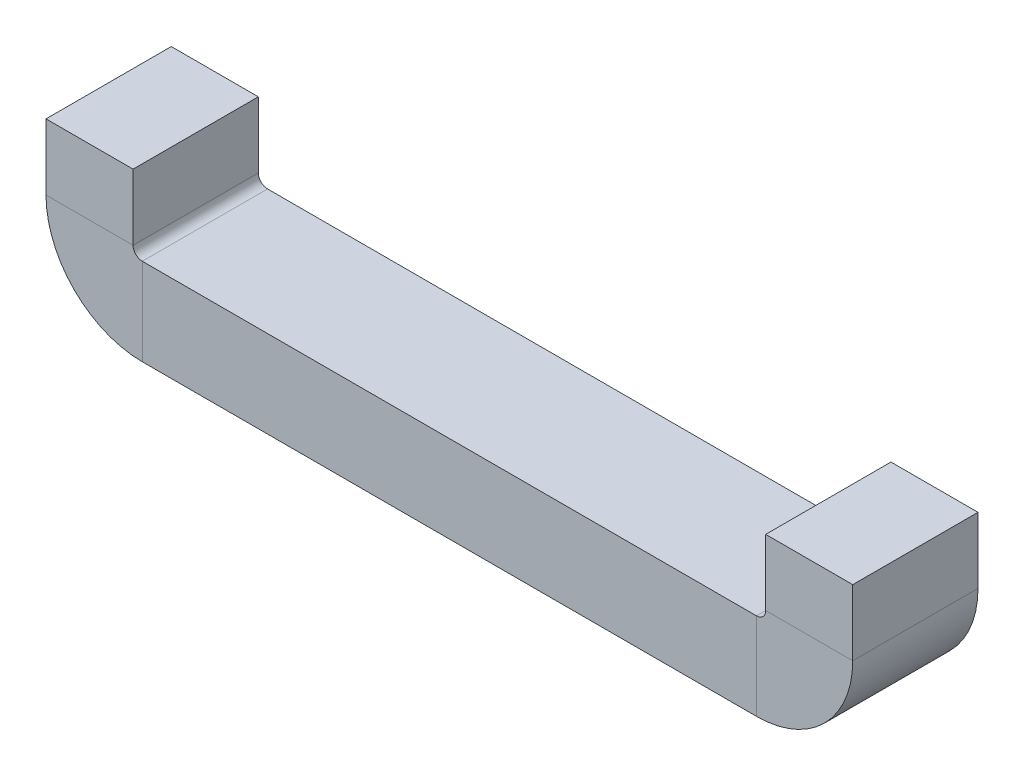
ISO-10303-21;
HEADER;
FILE_DESCRIPTION(('STEP AP214'),'2;1');
FILE_NAME('part.step','',(''),(''),'','','');
FILE_SCHEMA(('AUTOMOTIVE_DESIGN { 1 0 10303 214 1 1 1 1 }'));
ENDSEC;
DATA;
#1=APPLICATION_CONTEXT('core data for automotive mechanical design processes');
#2=APPLICATION_PROTOCOL_DEFINITION('international standard','automotive_design',2000,#1);
#3=PRODUCT_CONTEXT('',#1,'mechanical');
#4=PRODUCT('Part','Part','',(#3));
#5=PRODUCT_RELATED_PRODUCT_CATEGORY('part','',(#4));
#6=PRODUCT_DEFINITION_FORMATION('','',#4);
#7=PRODUCT_DEFINITION_CONTEXT('part definition',#1,'design');
#8=PRODUCT_DEFINITION('design','',#6,#7);
#9=PRODUCT_DEFINITION_SHAPE('','',#8);
#10=(LENGTH_UNIT() NAMED_UNIT(*) SI_UNIT(.MILLI.,.METRE.));
#11=(NAMED_UNIT(*) PLANE_ANGLE_UNIT() SI_UNIT($,.RADIAN.));
#12=(NAMED_UNIT(*) SI_UNIT($,.STERADIAN.) SOLID_ANGLE_UNIT());
#13=UNCERTAINTY_MEASURE_WITH_UNIT(LENGTH_MEASURE(1.E-05),#10,'distance_accuracy_value','');
#14=(GEOMETRIC_REPRESENTATION_CONTEXT(3) GLOBAL_UNCERTAINTY_ASSIGNED_CONTEXT((#13)) GLOBAL_UNIT_ASSIGNED_CONTEXT((#10,
#11,#12)) REPRESENTATION_CONTEXT('',''));
#15=CARTESIAN_POINT('',(0.,0.,0.));
#16=DIRECTION('',(0.,0.,1.));
#17=DIRECTION('',(1.,0.,0.));
#18=AXIS2_PLACEMENT_3D('',#15,#16,#17);
#19=CARTESIAN_POINT('',(0.,-6.95,0.));
#20=DIRECTION('',(0.,-1.,0.));
#21=DIRECTION('',(0.,0.,-1.));
#22=AXIS2_PLACEMENT_3D('',#19,#20,#21);
#23=PLANE('',#22);
#24=DIRECTION('',(-1.,0.,0.));
#25=VECTOR('',#24,1.);
#26=CARTESIAN_POINT('',(25.25,-6.95,-5.));
#27=LINE('',#26,#25);
#28=CARTESIAN_POINT('',(24.5134,-6.95,-5.));
#29=VERTEX_POINT('',#28);
#30=CARTESIAN_POINT('',(-24.5134,-6.95,-5.));
#31=VERTEX_POINT('',#30);
#32=EDGE_CURVE('E11',#29,#31,#27,.T.);
#33=ORIENTED_EDGE('',*,*,#32,.F.);
#34=DIRECTION('',(0.,0.,-1.));
#35=VECTOR('',#34,1.);
#36=CARTESIAN_POINT('',(24.5134,-6.95,-5.));
#37=LINE('',#36,#35);
#38=CARTESIAN_POINT('',(24.5134,-6.95,4.99999999999999));
#39=VERTEX_POINT('',#38);
#40=EDGE_CURVE('E138',#29,#39,#37,.F.);
#41=ORIENTED_EDGE('',*,*,#40,.T.);
#42=DIRECTION('',(1.,0.,0.));
#43=VECTOR('',#42,1.);
#44=CARTESIAN_POINT('',(25.25,-6.95,5.));
#45=LINE('',#44,#43);
#46=CARTESIAN_POINT('',(-24.5134,-6.95,5.00000000000001));
#47=VERTEX_POINT('',#46);
#48=EDGE_CURVE('E52',#47,#39,#45,.T.);
#49=ORIENTED_EDGE('',*,*,#48,.F.);
#50=DIRECTION('',(0.,0.,1.));
#51=VECTOR('',#50,1.);
#52=CARTESIAN_POINT('',(-24.5134,-6.95,5.00000000000001));
#53=LINE('',#52,#51);
#54=EDGE_CURVE('E225',#47,#31,#53,.F.);
#55=ORIENTED_EDGE('',*,*,#54,.T.);
#56=EDGE_LOOP('',(#33,#41,#49,#55));
#57=FACE_BOUND('',#56,.T.);
#58=ADVANCED_FACE('F43',(#57),#23,.T.);
#59=CARTESIAN_POINT('',(0.,0.,0.));
#60=DIRECTION('',(0.,-1.,0.));
#61=DIRECTION('',(0.,0.,-1.));
#62=AXIS2_PLACEMENT_3D('',#59,#60,#61);
#63=PLANE('',#62);
#64=DIRECTION('',(0.,0.,-1.));
#65=VECTOR('',#64,1.);
#66=CARTESIAN_POINT('',(24.5134,0.,-5.));
#67=LINE('',#66,#65);
#68=CARTESIAN_POINT('',(24.5134,0.,-5.));
#69=VERTEX_POINT('',#68);
#70=CARTESIAN_POINT('',(24.5134,0.,4.99999999999999));
#71=VERTEX_POINT('',#70);
#72=EDGE_CURVE('E188',#69,#71,#67,.F.);
#73=ORIENTED_EDGE('',*,*,#72,.F.);
#74=DIRECTION('',(-1.,0.,0.));
#75=VECTOR('',#74,1.);
#76=CARTESIAN_POINT('',(25.25,0.,-5.));
#77=LINE('',#76,#75);
#78=CARTESIAN_POINT('',(-24.5134,0.,-5.));
#79=VERTEX_POINT('',#78);
#80=EDGE_CURVE('E47',#69,#79,#77,.T.);
#81=ORIENTED_EDGE('',*,*,#80,.T.);
#82=DIRECTION('',(0.,0.,1.));
#83=VECTOR('',#82,1.);
#84=CARTESIAN_POINT('',(-24.5134,0.,5.00000000000001));
#85=LINE('',#84,#83);
#86=CARTESIAN_POINT('',(-24.5134,0.,5.00000000000001));
#87=VERTEX_POINT('',#86);
#88=EDGE_CURVE('E236',#87,#79,#85,.F.);
#89=ORIENTED_EDGE('',*,*,#88,.F.);
#90=DIRECTION('',(1.,0.,0.));
#91=VECTOR('',#90,1.);
#92=CARTESIAN_POINT('',(25.25,0.,5.));
#93=LINE('',#92,#91);
#94=EDGE_CURVE('E242',#87,#71,#93,.T.);
#95=ORIENTED_EDGE('',*,*,#94,.T.);
#96=EDGE_LOOP('',(#73,#81,#89,#95));
#97=FACE_BOUND('',#96,.T.);
#98=ADVANCED_FACE('F254',(#97),#63,.F.);
#99=CARTESIAN_POINT('',(25.25,-6.95,-5.));
#100=DIRECTION('',(0.,0.,-1.));
#101=DIRECTION('',(-1.,0.,0.));
#102=AXIS2_PLACEMENT_3D('',#99,#100,#101);
#103=PLANE('',#102);
#104=ORIENTED_EDGE('',*,*,#80,.F.);
#105=DIRECTION('',(0.,-1.,0.));
#106=VECTOR('',#105,1.);
#107=CARTESIAN_POINT('',(24.5134,0.,-5.));
#108=LINE('',#107,#106);
#109=EDGE_CURVE('E184',#69,#29,#108,.T.);
#110=ORIENTED_EDGE('',*,*,#109,.T.);
#111=ORIENTED_EDGE('',*,*,#32,.T.);
#112=DIRECTION('',(0.,-1.,0.));
#113=VECTOR('',#112,1.);
#114=CARTESIAN_POINT('',(-24.5134,0.,-5.));
#115=LINE('',#114,#113);
#116=EDGE_CURVE('E240',#79,#31,#115,.T.);
#117=ORIENTED_EDGE('',*,*,#116,.F.);
#118=EDGE_LOOP('',(#104,#110,#111,#117));
#119=FACE_BOUND('',#118,.T.);
#120=ADVANCED_FACE('F256',(#119),#103,.T.);
#121=CARTESIAN_POINT('',(25.25,-6.95,5.));
#122=DIRECTION('',(0.,0.,1.));
#123=DIRECTION('',(1.,0.,0.));
#124=AXIS2_PLACEMENT_3D('',#121,#122,#123);
#125=PLANE('',#124);
#126=DIRECTION('',(0.,-1.,0.));
#127=VECTOR('',#126,1.);
#128=CARTESIAN_POINT('',(24.5134,0.,4.99999999999999));
#129=LINE('',#128,#127);
#130=EDGE_CURVE('E191',#71,#39,#129,.T.);
#131=ORIENTED_EDGE('',*,*,#130,.F.);
#132=ORIENTED_EDGE('',*,*,#94,.F.);
#133=DIRECTION('',(0.,-1.,0.));
#134=VECTOR('',#133,1.);
#135=CARTESIAN_POINT('',(-24.5134,0.,5.00000000000001));
#136=LINE('',#135,#134);
#137=EDGE_CURVE('E230',#87,#47,#136,.T.);
#138=ORIENTED_EDGE('',*,*,#137,.T.);
#139=ORIENTED_EDGE('',*,*,#48,.T.);
#140=EDGE_LOOP('',(#131,#132,#138,#139));
#141=FACE_BOUND('',#140,.T.);
#142=ADVANCED_FACE('F45',(#141),#125,.T.);
#143=CARTESIAN_POINT('',(-24.5134,0.7366,-5.));
#144=DIRECTION('',(0.,0.,-1.));
#145=DIRECTION('',(-1.,0.,0.));
#146=AXIS2_PLACEMENT_3D('',#143,#144,#145);
#147=PLANE('',#146);
#148=DIRECTION('',(-1.,0.,0.));
#149=VECTOR('',#148,1.);
#150=CARTESIAN_POINT('',(-25.25,0.736599999999997,-5.));
#151=LINE('',#150,#149);
#152=CARTESIAN_POINT('',(-25.25,0.736599999999997,-5.));
#153=VERTEX_POINT('',#152);
#154=CARTESIAN_POINT('',(-32.2,0.736599999999972,-5.));
#155=VERTEX_POINT('',#154);
#156=EDGE_CURVE('E193',#153,#155,#151,.T.);
#157=ORIENTED_EDGE('',*,*,#156,.F.);
#158=CARTESIAN_POINT('',(-24.5134,0.7366,-5.));
#159=DIRECTION('',(0.,0.,1.));
#160=DIRECTION('',(1.,0.,0.));
#161=AXIS2_PLACEMENT_3D('',#158,#159,#160);
#162=CIRCLE('',#161,0.736600000000004);
#163=EDGE_CURVE('E233',#79,#153,#162,.F.);
#164=ORIENTED_EDGE('',*,*,#163,.F.);
#165=ORIENTED_EDGE('',*,*,#116,.T.);
#166=CARTESIAN_POINT('',(-24.5134,0.7366,-5.));
#167=DIRECTION('',(0.,0.,1.));
#168=DIRECTION('',(1.,0.,0.));
#169=AXIS2_PLACEMENT_3D('',#166,#167,#168);
#170=CIRCLE('',#169,7.6866);
#171=EDGE_CURVE('E60',#31,#155,#170,.F.);
#172=ORIENTED_EDGE('',*,*,#171,.T.);
#173=EDGE_LOOP('',(#157,#164,#165,#172));
#174=FACE_BOUND('',#173,.T.);
#175=ADVANCED_FACE('F260',(#174),#147,.T.);
#176=CARTESIAN_POINT('',(-24.5134,0.7366,5.00000000000001));
#177=DIRECTION('',(0.,0.,-1.));
#178=DIRECTION('',(-1.,0.,0.));
#179=AXIS2_PLACEMENT_3D('',#176,#177,#178);
#180=PLANE('',#179);
#181=CARTESIAN_POINT('',(-24.5134,0.7366,5.00000000000001));
#182=DIRECTION('',(0.,0.,1.));
#183=DIRECTION('',(1.,0.,0.));
#184=AXIS2_PLACEMENT_3D('',#181,#182,#183);
#185=CIRCLE('',#184,0.736600000000004);
#186=CARTESIAN_POINT('',(-25.25,0.736599999999997,5.00000000000001));
#187=VERTEX_POINT('',#186);
#188=EDGE_CURVE('E224',#187,#87,#185,.T.);
#189=ORIENTED_EDGE('',*,*,#188,.F.);
#190=DIRECTION('',(-1.,0.,0.));
#191=VECTOR('',#190,1.);
#192=CARTESIAN_POINT('',(-25.25,0.736599999999997,5.00000000000001));
#193=LINE('',#192,#191);
#194=CARTESIAN_POINT('',(-32.2,0.736599999999973,5.00000000000001));
#195=VERTEX_POINT('',#194);
#196=EDGE_CURVE('E197',#187,#195,#193,.T.);
#197=ORIENTED_EDGE('',*,*,#196,.T.);
#198=CARTESIAN_POINT('',(-24.5134,0.7366,5.00000000000001));
#199=DIRECTION('',(0.,0.,1.));
#200=DIRECTION('',(1.,0.,0.));
#201=AXIS2_PLACEMENT_3D('',#198,#199,#200);
#202=CIRCLE('',#201,7.6866);
#203=EDGE_CURVE('E228',#195,#47,#202,.T.);
#204=ORIENTED_EDGE('',*,*,#203,.T.);
#205=ORIENTED_EDGE('',*,*,#137,.F.);
#206=EDGE_LOOP('',(#189,#197,#204,#205));
#207=FACE_BOUND('',#206,.T.);
#208=ADVANCED_FACE('F284',(#207),#180,.F.);
#209=CARTESIAN_POINT('',(-24.5134,0.7366,5.00000000000001));
#210=DIRECTION('',(0.,0.,1.));
#211=DIRECTION('',(-1.,0.,0.));
#212=AXIS2_PLACEMENT_3D('',#209,#210,#211);
#213=CYLINDRICAL_SURFACE('',#212,7.6866);
#214=ORIENTED_EDGE('',*,*,#54,.F.);
#215=ORIENTED_EDGE('',*,*,#203,.F.);
#216=DIRECTION('',(0.,0.,-1.));
#217=VECTOR('',#216,1.);
#218=CARTESIAN_POINT('',(-32.2,0.736599999999973,0.));
#219=LINE('',#218,#217);
#220=EDGE_CURVE('E200',#195,#155,#219,.T.);
#221=ORIENTED_EDGE('',*,*,#220,.T.);
#222=ORIENTED_EDGE('',*,*,#171,.F.);
#223=EDGE_LOOP('',(#214,#215,#221,#222));
#224=FACE_BOUND('',#223,.T.);
#225=ADVANCED_FACE('F287',(#224),#213,.T.);
#226=CARTESIAN_POINT('',(-24.5134,0.7366,5.00000000000001));
#227=DIRECTION('',(0.,0.,1.));
#228=DIRECTION('',(-1.,0.,0.));
#229=AXIS2_PLACEMENT_3D('',#226,#227,#228);
#230=CYLINDRICAL_SURFACE('',#229,0.736600000000004);
#231=ORIENTED_EDGE('',*,*,#88,.T.);
#232=ORIENTED_EDGE('',*,*,#163,.T.);
#233=DIRECTION('',(0.,0.,1.));
#234=VECTOR('',#233,1.);
#235=CARTESIAN_POINT('',(-25.25,0.736599999999997,-5.));
#236=LINE('',#235,#234);
#237=EDGE_CURVE('E195',#153,#187,#236,.T.);
#238=ORIENTED_EDGE('',*,*,#237,.T.);
#239=ORIENTED_EDGE('',*,*,#188,.T.);
#240=EDGE_LOOP('',(#231,#232,#238,#239));
#241=FACE_BOUND('',#240,.T.);
#242=ADVANCED_FACE('F263',(#241),#230,.F.);
#243=CARTESIAN_POINT('',(-32.2,5.99999999999998,5.00000000000001));
#244=DIRECTION('',(0.,0.,-1.));
#245=DIRECTION('',(-1.,0.,0.));
#246=AXIS2_PLACEMENT_3D('',#243,#244,#245);
#247=PLANE('',#246);
#248=ORIENTED_EDGE('',*,*,#196,.F.);
#249=DIRECTION('',(0.,1.,0.));
#250=VECTOR('',#249,1.);
#251=CARTESIAN_POINT('',(-25.25,6.,5.00000000000001));
#252=LINE('',#251,#250);
#253=CARTESIAN_POINT('',(-25.25,6.,5.00000000000001));
#254=VERTEX_POINT('',#253);
#255=EDGE_CURVE('E204',#187,#254,#252,.T.);
#256=ORIENTED_EDGE('',*,*,#255,.T.);
#257=DIRECTION('',(1.,0.,0.));
#258=VECTOR('',#257,1.);
#259=CARTESIAN_POINT('',(-32.2,5.99999999999998,5.00000000000001));
#260=LINE('',#259,#258);
#261=CARTESIAN_POINT('',(-32.2,5.99999999999998,5.00000000000001));
#262=VERTEX_POINT('',#261);
#263=EDGE_CURVE('E221',#262,#254,#260,.T.);
#264=ORIENTED_EDGE('',*,*,#263,.F.);
#265=DIRECTION('',(0.,1.,0.));
#266=VECTOR('',#265,1.);
#267=CARTESIAN_POINT('',(-32.2,5.99999999999998,5.00000000000001));
#268=LINE('',#267,#266);
#269=EDGE_CURVE('E205',#195,#262,#268,.T.);
#270=ORIENTED_EDGE('',*,*,#269,.F.);
#271=EDGE_LOOP('',(#248,#256,#264,#270));
#272=FACE_BOUND('',#271,.T.);
#273=ADVANCED_FACE('F281',(#272),#247,.F.);
#274=CARTESIAN_POINT('',(-32.2,0.,-5.));
#275=DIRECTION('',(0.,0.,1.));
#276=DIRECTION('',(1.,0.,0.));
#277=AXIS2_PLACEMENT_3D('',#274,#275,#276);
#278=PLANE('',#277);
#279=ORIENTED_EDGE('',*,*,#156,.T.);
#280=DIRECTION('',(0.,-1.,0.));
#281=VECTOR('',#280,1.);
#282=CARTESIAN_POINT('',(-32.2,0.,-5.));
#283=LINE('',#282,#281);
#284=CARTESIAN_POINT('',(-32.2,5.99999999999998,-5.));
#285=VERTEX_POINT('',#284);
#286=EDGE_CURVE('E210',#285,#155,#283,.T.);
#287=ORIENTED_EDGE('',*,*,#286,.F.);
#288=DIRECTION('',(1.,0.,0.));
#289=VECTOR('',#288,1.);
#290=CARTESIAN_POINT('',(-32.2,5.99999999999998,-5.));
#291=LINE('',#290,#289);
#292=CARTESIAN_POINT('',(-25.25,6.,-5.));
#293=VERTEX_POINT('',#292);
#294=EDGE_CURVE('E213',#285,#293,#291,.T.);
#295=ORIENTED_EDGE('',*,*,#294,.T.);
#296=DIRECTION('',(0.,-1.,0.));
#297=VECTOR('',#296,1.);
#298=CARTESIAN_POINT('',(-25.25,0.,-5.));
#299=LINE('',#298,#297);
#300=EDGE_CURVE('E208',#293,#153,#299,.T.);
#301=ORIENTED_EDGE('',*,*,#300,.T.);
#302=EDGE_LOOP('',(#279,#287,#295,#301));
#303=FACE_BOUND('',#302,.T.);
#304=ADVANCED_FACE('F271',(#303),#278,.F.);
#305=CARTESIAN_POINT('',(-32.2,-1.11869330841789E-13,0.));
#306=DIRECTION('',(1.,0.,0.));
#307=DIRECTION('',(0.,1.,0.));
#308=AXIS2_PLACEMENT_3D('',#305,#306,#307);
#309=PLANE('',#308);
#310=ORIENTED_EDGE('',*,*,#220,.F.);
#311=ORIENTED_EDGE('',*,*,#269,.T.);
#312=DIRECTION('',(0.,0.,-1.));
#313=VECTOR('',#312,1.);
#314=CARTESIAN_POINT('',(-32.2,5.99999999999998,-5.));
#315=LINE('',#314,#313);
#316=EDGE_CURVE('E207',#262,#285,#315,.T.);
#317=ORIENTED_EDGE('',*,*,#316,.T.);
#318=ORIENTED_EDGE('',*,*,#286,.T.);
#319=EDGE_LOOP('',(#310,#311,#317,#318));
#320=FACE_BOUND('',#319,.T.);
#321=ADVANCED_FACE('F286',(#320),#309,.F.);
#322=CARTESIAN_POINT('',(-25.25,0.,0.));
#323=DIRECTION('',(1.,0.,0.));
#324=DIRECTION('',(0.,1.,0.));
#325=AXIS2_PLACEMENT_3D('',#322,#323,#324);
#326=PLANE('',#325);
#327=ORIENTED_EDGE('',*,*,#255,.F.);
#328=ORIENTED_EDGE('',*,*,#237,.F.);
#329=ORIENTED_EDGE('',*,*,#300,.F.);
#330=DIRECTION('',(0.,0.,-1.));
#331=VECTOR('',#330,1.);
#332=CARTESIAN_POINT('',(-25.25,6.,-5.));
#333=LINE('',#332,#331);
#334=EDGE_CURVE('E215',#254,#293,#333,.T.);
#335=ORIENTED_EDGE('',*,*,#334,.F.);
#336=EDGE_LOOP('',(#327,#328,#329,#335));
#337=FACE_BOUND('',#336,.T.);
#338=ADVANCED_FACE('F268',(#337),#326,.T.);
#339=CARTESIAN_POINT('',(-32.2,5.99999999999998,-5.));
#340=DIRECTION('',(0.,-1.,0.));
#341=DIRECTION('',(1.,0.,0.));
#342=AXIS2_PLACEMENT_3D('',#339,#340,#341);
#343=PLANE('',#342);
#344=ORIENTED_EDGE('',*,*,#334,.T.);
#345=ORIENTED_EDGE('',*,*,#294,.F.);
#346=ORIENTED_EDGE('',*,*,#316,.F.);
#347=ORIENTED_EDGE('',*,*,#263,.T.);
#348=EDGE_LOOP('',(#344,#345,#346,#347));
#349=FACE_BOUND('',#348,.T.);
#350=ADVANCED_FACE('F276',(#349),#343,.F.);
#351=CARTESIAN_POINT('',(24.5134,0.7366,4.99999999999999));
#352=DIRECTION('',(0.,0.,1.));
#353=DIRECTION('',(0.,-1.,0.));
#354=AXIS2_PLACEMENT_3D('',#351,#352,#353);
#355=PLANE('',#354);
#356=DIRECTION('',(1.,0.,0.));
#357=VECTOR('',#356,1.);
#358=CARTESIAN_POINT('',(25.25,0.736599999999997,5.));
#359=LINE('',#358,#357);
#360=CARTESIAN_POINT('',(25.25,0.736599999999997,4.99999999999999));
#361=VERTEX_POINT('',#360);
#362=CARTESIAN_POINT('',(32.2,0.736599999999973,4.99999999999999));
#363=VERTEX_POINT('',#362);
#364=EDGE_CURVE('E296',#361,#363,#359,.T.);
#365=ORIENTED_EDGE('',*,*,#364,.F.);
#366=CARTESIAN_POINT('',(24.5134,0.7366,4.99999999999999));
#367=DIRECTION('',(0.,0.,-1.));
#368=DIRECTION('',(0.,1.,0.));
#369=AXIS2_PLACEMENT_3D('',#366,#367,#368);
#370=CIRCLE('',#369,0.7366);
#371=EDGE_CURVE('E141',#71,#361,#370,.F.);
#372=ORIENTED_EDGE('',*,*,#371,.F.);
#373=ORIENTED_EDGE('',*,*,#130,.T.);
#374=CARTESIAN_POINT('',(24.5134,0.7366,4.99999999999999));
#375=DIRECTION('',(0.,0.,-1.));
#376=DIRECTION('',(0.,1.,0.));
#377=AXIS2_PLACEMENT_3D('',#374,#375,#376);
#378=CIRCLE('',#377,7.6866);
#379=EDGE_CURVE('E68',#39,#363,#378,.F.);
#380=ORIENTED_EDGE('',*,*,#379,.T.);
#381=EDGE_LOOP('',(#365,#372,#373,#380));
#382=FACE_BOUND('',#381,.T.);
#383=ADVANCED_FACE('F294',(#382),#355,.T.);
#384=CARTESIAN_POINT('',(24.5134,0.736599999999996,-5.));
#385=DIRECTION('',(0.,0.,1.));
#386=DIRECTION('',(0.,-1.,0.));
#387=AXIS2_PLACEMENT_3D('',#384,#385,#386);
#388=PLANE('',#387);
#389=CARTESIAN_POINT('',(24.5134,0.736599999999996,-5.));
#390=DIRECTION('',(0.,0.,-1.));
#391=DIRECTION('',(0.,1.,0.));
#392=AXIS2_PLACEMENT_3D('',#389,#390,#391);
#393=CIRCLE('',#392,0.7366);
#394=CARTESIAN_POINT('',(25.25,0.736599999999993,-5.));
#395=VERTEX_POINT('',#394);
#396=EDGE_CURVE('E148',#395,#69,#393,.T.);
#397=ORIENTED_EDGE('',*,*,#396,.F.);
#398=DIRECTION('',(1.,0.,0.));
#399=VECTOR('',#398,1.);
#400=CARTESIAN_POINT('',(25.25,0.736599999999993,-5.));
#401=LINE('',#400,#399);
#402=CARTESIAN_POINT('',(32.2,0.736599999999969,-5.00000000000001));
#403=VERTEX_POINT('',#402);
#404=EDGE_CURVE('E145',#395,#403,#401,.T.);
#405=ORIENTED_EDGE('',*,*,#404,.T.);
#406=CARTESIAN_POINT('',(24.5134,0.736599999999996,-5.));
#407=DIRECTION('',(0.,0.,-1.));
#408=DIRECTION('',(0.,1.,0.));
#409=AXIS2_PLACEMENT_3D('',#406,#407,#408);
#410=CIRCLE('',#409,7.6866);
#411=EDGE_CURVE('E132',#403,#29,#410,.T.);
#412=ORIENTED_EDGE('',*,*,#411,.T.);
#413=ORIENTED_EDGE('',*,*,#109,.F.);
#414=EDGE_LOOP('',(#397,#405,#412,#413));
#415=FACE_BOUND('',#414,.T.);
#416=ADVANCED_FACE('F146',(#415),#388,.F.);
#417=CARTESIAN_POINT('',(24.5134,0.736599999999996,-5.));
#418=DIRECTION('',(0.,0.,-1.));
#419=DIRECTION('',(1.,0.,0.));
#420=AXIS2_PLACEMENT_3D('',#417,#418,#419);
#421=CYLINDRICAL_SURFACE('',#420,7.6866);
#422=ORIENTED_EDGE('',*,*,#40,.F.);
#423=ORIENTED_EDGE('',*,*,#411,.F.);
#424=DIRECTION('',(0.,0.,1.));
#425=VECTOR('',#424,1.);
#426=CARTESIAN_POINT('',(32.2,0.736599999999971,0.));
#427=LINE('',#426,#425);
#428=EDGE_CURVE('E136',#403,#363,#427,.T.);
#429=ORIENTED_EDGE('',*,*,#428,.T.);
#430=ORIENTED_EDGE('',*,*,#379,.F.);
#431=EDGE_LOOP('',(#422,#423,#429,#430));
#432=FACE_BOUND('',#431,.T.);
#433=ADVANCED_FACE('F134',(#432),#421,.T.);
#434=CARTESIAN_POINT('',(24.5134,0.736599999999996,-5.));
#435=DIRECTION('',(0.,0.,-1.));
#436=DIRECTION('',(1.,0.,0.));
#437=AXIS2_PLACEMENT_3D('',#434,#435,#436);
#438=CYLINDRICAL_SURFACE('',#437,0.7366);
#439=ORIENTED_EDGE('',*,*,#72,.T.);
#440=ORIENTED_EDGE('',*,*,#371,.T.);
#441=DIRECTION('',(0.,0.,-1.));
#442=VECTOR('',#441,1.);
#443=CARTESIAN_POINT('',(25.25,0.736599999999997,5.));
#444=LINE('',#443,#442);
#445=EDGE_CURVE('E152',#361,#395,#444,.T.);
#446=ORIENTED_EDGE('',*,*,#445,.T.);
#447=ORIENTED_EDGE('',*,*,#396,.T.);
#448=EDGE_LOOP('',(#439,#440,#446,#447));
#449=FACE_BOUND('',#448,.T.);
#450=ADVANCED_FACE('F299',(#449),#438,.F.);
#451=CARTESIAN_POINT('',(32.2,5.99999999999998,-5.00000000000001));
#452=DIRECTION('',(0.,0.,1.));
#453=DIRECTION('',(1.,0.,0.));
#454=AXIS2_PLACEMENT_3D('',#451,#452,#453);
#455=PLANE('',#454);
#456=ORIENTED_EDGE('',*,*,#404,.F.);
#457=DIRECTION('',(0.,1.,0.));
#458=VECTOR('',#457,1.);
#459=CARTESIAN_POINT('',(25.25,6.,-5.));
#460=LINE('',#459,#458);
#461=CARTESIAN_POINT('',(25.25,6.,-5.));
#462=VERTEX_POINT('',#461);
#463=EDGE_CURVE('E161',#395,#462,#460,.T.);
#464=ORIENTED_EDGE('',*,*,#463,.T.);
#465=DIRECTION('',(-1.,0.,0.));
#466=VECTOR('',#465,1.);
#467=CARTESIAN_POINT('',(32.2,5.99999999999998,-5.00000000000001));
#468=LINE('',#467,#466);
#469=CARTESIAN_POINT('',(32.2,5.99999999999998,-5.00000000000001));
#470=VERTEX_POINT('',#469);
#471=EDGE_CURVE('E165',#470,#462,#468,.T.);
#472=ORIENTED_EDGE('',*,*,#471,.F.);
#473=DIRECTION('',(0.,1.,0.));
#474=VECTOR('',#473,1.);
#475=CARTESIAN_POINT('',(32.2,5.99999999999998,-5.00000000000001));
#476=LINE('',#475,#474);
#477=EDGE_CURVE('E157',#403,#470,#476,.T.);
#478=ORIENTED_EDGE('',*,*,#477,.F.);
#479=EDGE_LOOP('',(#456,#464,#472,#478));
#480=FACE_BOUND('',#479,.T.);
#481=ADVANCED_FACE('F163',(#480),#455,.F.);
#482=CARTESIAN_POINT('',(32.2,0.,4.99999999999999));
#483=DIRECTION('',(0.,0.,-1.));
#484=DIRECTION('',(-1.,0.,0.));
#485=AXIS2_PLACEMENT_3D('',#482,#483,#484);
#486=PLANE('',#485);
#487=ORIENTED_EDGE('',*,*,#364,.T.);
#488=DIRECTION('',(0.,-1.,0.));
#489=VECTOR('',#488,1.);
#490=CARTESIAN_POINT('',(32.2,0.,4.99999999999999));
#491=LINE('',#490,#489);
#492=CARTESIAN_POINT('',(32.2,5.99999999999998,4.99999999999999));
#493=VERTEX_POINT('',#492);
#494=EDGE_CURVE('E160',#493,#363,#491,.T.);
#495=ORIENTED_EDGE('',*,*,#494,.F.);
#496=DIRECTION('',(-1.,0.,0.));
#497=VECTOR('',#496,1.);
#498=CARTESIAN_POINT('',(32.2,5.99999999999998,4.99999999999999));
#499=LINE('',#498,#497);
#500=CARTESIAN_POINT('',(25.25,6.,5.));
#501=VERTEX_POINT('',#500);
#502=EDGE_CURVE('E177',#493,#501,#499,.T.);
#503=ORIENTED_EDGE('',*,*,#502,.T.);
#504=DIRECTION('',(0.,-1.,0.));
#505=VECTOR('',#504,1.);
#506=CARTESIAN_POINT('',(25.25,0.,5.));
#507=LINE('',#506,#505);
#508=EDGE_CURVE('E168',#501,#361,#507,.T.);
#509=ORIENTED_EDGE('',*,*,#508,.T.);
#510=EDGE_LOOP('',(#487,#495,#503,#509));
#511=FACE_BOUND('',#510,.T.);
#512=ADVANCED_FACE('F306',(#511),#486,.F.);
#513=CARTESIAN_POINT('',(32.2,-1.11869330841789E-13,0.));
#514=DIRECTION('',(-1.,0.,0.));
#515=DIRECTION('',(0.,-1.,0.));
#516=AXIS2_PLACEMENT_3D('',#513,#514,#515);
#517=PLANE('',#516);
#518=ORIENTED_EDGE('',*,*,#428,.F.);
#519=ORIENTED_EDGE('',*,*,#477,.T.);
#520=DIRECTION('',(0.,0.,1.));
#521=VECTOR('',#520,1.);
#522=CARTESIAN_POINT('',(32.2,5.99999999999998,4.99999999999999));
#523=LINE('',#522,#521);
#524=EDGE_CURVE('E167',#470,#493,#523,.T.);
#525=ORIENTED_EDGE('',*,*,#524,.T.);
#526=ORIENTED_EDGE('',*,*,#494,.T.);
#527=EDGE_LOOP('',(#518,#519,#525,#526));
#528=FACE_BOUND('',#527,.T.);
#529=ADVANCED_FACE('F156',(#528),#517,.F.);
#530=CARTESIAN_POINT('',(25.25,0.,0.));
#531=DIRECTION('',(-1.,0.,0.));
#532=DIRECTION('',(0.,-1.,0.));
#533=AXIS2_PLACEMENT_3D('',#530,#531,#532);
#534=PLANE('',#533);
#535=ORIENTED_EDGE('',*,*,#463,.F.);
#536=ORIENTED_EDGE('',*,*,#445,.F.);
#537=ORIENTED_EDGE('',*,*,#508,.F.);
#538=DIRECTION('',(0.,0.,1.));
#539=VECTOR('',#538,1.);
#540=CARTESIAN_POINT('',(25.25,6.,5.));
#541=LINE('',#540,#539);
#542=EDGE_CURVE('E172',#462,#501,#541,.T.);
#543=ORIENTED_EDGE('',*,*,#542,.F.);
#544=EDGE_LOOP('',(#535,#536,#537,#543));
#545=FACE_BOUND('',#544,.T.);
#546=ADVANCED_FACE('F302',(#545),#534,.T.);
#547=CARTESIAN_POINT('',(32.2,5.99999999999998,4.99999999999999));
#548=DIRECTION('',(0.,-1.,0.));
#549=DIRECTION('',(1.,0.,0.));
#550=AXIS2_PLACEMENT_3D('',#547,#548,#549);
#551=PLANE('',#550);
#552=ORIENTED_EDGE('',*,*,#542,.T.);
#553=ORIENTED_EDGE('',*,*,#502,.F.);
#554=ORIENTED_EDGE('',*,*,#524,.F.);
#555=ORIENTED_EDGE('',*,*,#471,.T.);
#556=EDGE_LOOP('',(#552,#553,#554,#555));
#557=FACE_BOUND('',#556,.T.);
#558=ADVANCED_FACE('F309',(#557),#551,.F.);
#559=CLOSED_SHELL('',(#58,#98,#120,#142,#175,#208,#225,#242,#273,#304,#321,#338,#350,#383,#416,
#433,#450,#481,#512,#529,#546,#558));
#560=MANIFOLD_SOLID_BREP('B2',#559);
#561=ADVANCED_BREP_SHAPE_REPRESENTATION('',(#18,#560),#14);
#562=SHAPE_DEFINITION_REPRESENTATION(#9,#561);
ENDSEC;
END-ISO-10303-21;
